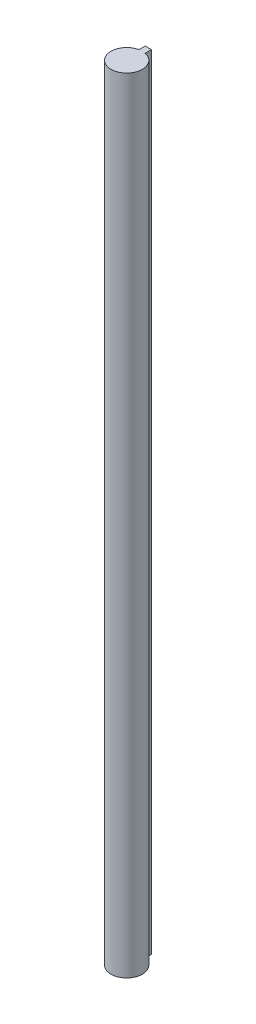
ISO-10303-21;
HEADER;
FILE_DESCRIPTION(('STEP AP214'),'2;1');
FILE_NAME('part.step','',(''),(''),'','','');
FILE_SCHEMA(('AUTOMOTIVE_DESIGN { 1 0 10303 214 1 1 1 1 }'));
ENDSEC;
DATA;
#1=APPLICATION_CONTEXT('core data for automotive mechanical design processes');
#2=APPLICATION_PROTOCOL_DEFINITION('international standard','automotive_design',2000,#1);
#3=PRODUCT_CONTEXT('',#1,'mechanical');
#4=PRODUCT('Part','Part','',(#3));
#5=PRODUCT_RELATED_PRODUCT_CATEGORY('part','',(#4));
#6=PRODUCT_DEFINITION_FORMATION('','',#4);
#7=PRODUCT_DEFINITION_CONTEXT('part definition',#1,'design');
#8=PRODUCT_DEFINITION('design','',#6,#7);
#9=PRODUCT_DEFINITION_SHAPE('','',#8);
#10=(LENGTH_UNIT() NAMED_UNIT(*) SI_UNIT(.MILLI.,.METRE.));
#11=(NAMED_UNIT(*) PLANE_ANGLE_UNIT() SI_UNIT($,.RADIAN.));
#12=(NAMED_UNIT(*) SI_UNIT($,.STERADIAN.) SOLID_ANGLE_UNIT());
#13=UNCERTAINTY_MEASURE_WITH_UNIT(LENGTH_MEASURE(1.E-05),#10,'distance_accuracy_value','');
#14=(GEOMETRIC_REPRESENTATION_CONTEXT(3) GLOBAL_UNCERTAINTY_ASSIGNED_CONTEXT((#13)) GLOBAL_UNIT_ASSIGNED_CONTEXT((#10,
#11,#12)) REPRESENTATION_CONTEXT('',''));
#15=CARTESIAN_POINT('',(0.,0.,0.));
#16=DIRECTION('',(0.,0.,1.));
#17=DIRECTION('',(1.,0.,0.));
#18=AXIS2_PLACEMENT_3D('',#15,#16,#17);
#19=CARTESIAN_POINT('',(0.,500.,0.));
#20=DIRECTION('',(0.,-1.,0.));
#21=DIRECTION('',(0.,0.,-1.));
#22=AXIS2_PLACEMENT_3D('',#19,#20,#21);
#23=CYLINDRICAL_SURFACE('',#22,10.);
#24=CARTESIAN_POINT('',(0.,0.,0.));
#25=DIRECTION('',(0.,1.,0.));
#26=DIRECTION('',(0.,0.,1.));
#27=AXIS2_PLACEMENT_3D('',#24,#25,#26);
#28=CIRCLE('',#27,10.);
#29=CARTESIAN_POINT('',(-2.,0.,-9.79795897113271));
#30=VERTEX_POINT('',#29);
#31=CARTESIAN_POINT('',(2.,0.,-9.79795897113271));
#32=VERTEX_POINT('',#31);
#33=EDGE_CURVE('E98',#30,#32,#28,.T.);
#34=ORIENTED_EDGE('',*,*,#33,.T.);
#35=DIRECTION('',(0.,-1.,0.));
#36=VECTOR('',#35,1.);
#37=CARTESIAN_POINT('',(2.,500.,-9.79795897113271));
#38=LINE('',#37,#36);
#39=CARTESIAN_POINT('',(2.,500.,-9.79795897113271));
#40=VERTEX_POINT('',#39);
#41=EDGE_CURVE('E11',#40,#32,#38,.T.);
#42=ORIENTED_EDGE('',*,*,#41,.F.);
#43=CARTESIAN_POINT('',(0.,500.,0.));
#44=DIRECTION('',(0.,1.,0.));
#45=DIRECTION('',(0.,0.,1.));
#46=AXIS2_PLACEMENT_3D('',#43,#44,#45);
#47=CIRCLE('',#46,10.);
#48=CARTESIAN_POINT('',(-2.,500.,-9.79795897113271));
#49=VERTEX_POINT('',#48);
#50=EDGE_CURVE('E86',#49,#40,#47,.T.);
#51=ORIENTED_EDGE('',*,*,#50,.F.);
#52=DIRECTION('',(0.,-1.,0.));
#53=VECTOR('',#52,1.);
#54=CARTESIAN_POINT('',(-2.,500.,-9.79795897113271));
#55=LINE('',#54,#53);
#56=EDGE_CURVE('E94',#49,#30,#55,.T.);
#57=ORIENTED_EDGE('',*,*,#56,.T.);
#58=EDGE_LOOP('',(#34,#42,#51,#57));
#59=FACE_BOUND('',#58,.T.);
#60=ADVANCED_FACE('F35',(#59),#23,.T.);
#61=CARTESIAN_POINT('',(2.,500.,-9.79795897113271));
#62=DIRECTION('',(-1.,0.,0.));
#63=DIRECTION('',(0.,0.,1.));
#64=AXIS2_PLACEMENT_3D('',#61,#62,#63);
#65=PLANE('',#64);
#66=DIRECTION('',(0.,0.,-1.));
#67=VECTOR('',#66,1.);
#68=CARTESIAN_POINT('',(2.,0.,-9.79795897113271));
#69=LINE('',#68,#67);
#70=CARTESIAN_POINT('',(2.,0.,-13.7979589711327));
#71=VERTEX_POINT('',#70);
#72=EDGE_CURVE('E90',#32,#71,#69,.T.);
#73=ORIENTED_EDGE('',*,*,#72,.T.);
#74=DIRECTION('',(0.,-1.,0.));
#75=VECTOR('',#74,1.);
#76=CARTESIAN_POINT('',(2.,500.,-13.7979589711327));
#77=LINE('',#76,#75);
#78=CARTESIAN_POINT('',(2.,500.,-13.7979589711327));
#79=VERTEX_POINT('',#78);
#80=EDGE_CURVE('E43',#79,#71,#77,.T.);
#81=ORIENTED_EDGE('',*,*,#80,.F.);
#82=DIRECTION('',(0.,0.,-1.));
#83=VECTOR('',#82,1.);
#84=CARTESIAN_POINT('',(2.,500.,-9.79795897113271));
#85=LINE('',#84,#83);
#86=EDGE_CURVE('E81',#40,#79,#85,.T.);
#87=ORIENTED_EDGE('',*,*,#86,.F.);
#88=ORIENTED_EDGE('',*,*,#41,.T.);
#89=EDGE_LOOP('',(#73,#81,#87,#88));
#90=FACE_BOUND('',#89,.T.);
#91=ADVANCED_FACE('F89',(#90),#65,.F.);
#92=CARTESIAN_POINT('',(-2.,500.,-13.7979589711327));
#93=DIRECTION('',(0.,0.,1.));
#94=DIRECTION('',(1.,0.,0.));
#95=AXIS2_PLACEMENT_3D('',#92,#93,#94);
#96=PLANE('',#95);
#97=DIRECTION('',(-1.,0.,0.));
#98=VECTOR('',#97,1.);
#99=CARTESIAN_POINT('',(-2.,0.,-13.7979589711327));
#100=LINE('',#99,#98);
#101=CARTESIAN_POINT('',(-2.,0.,-13.7979589711327));
#102=VERTEX_POINT('',#101);
#103=EDGE_CURVE('E68',#71,#102,#100,.T.);
#104=ORIENTED_EDGE('',*,*,#103,.T.);
#105=DIRECTION('',(0.,-1.,0.));
#106=VECTOR('',#105,1.);
#107=CARTESIAN_POINT('',(-2.,500.,-13.7979589711327));
#108=LINE('',#107,#106);
#109=CARTESIAN_POINT('',(-2.,500.,-13.7979589711327));
#110=VERTEX_POINT('',#109);
#111=EDGE_CURVE('E91',#110,#102,#108,.T.);
#112=ORIENTED_EDGE('',*,*,#111,.F.);
#113=DIRECTION('',(-1.,0.,0.));
#114=VECTOR('',#113,1.);
#115=CARTESIAN_POINT('',(-2.,500.,-13.7979589711327));
#116=LINE('',#115,#114);
#117=EDGE_CURVE('E84',#79,#110,#116,.T.);
#118=ORIENTED_EDGE('',*,*,#117,.F.);
#119=ORIENTED_EDGE('',*,*,#80,.T.);
#120=EDGE_LOOP('',(#104,#112,#118,#119));
#121=FACE_BOUND('',#120,.T.);
#122=ADVANCED_FACE('F92',(#121),#96,.F.);
#123=CARTESIAN_POINT('',(-2.,500.,-9.79795897113271));
#124=DIRECTION('',(1.,0.,0.));
#125=DIRECTION('',(0.,0.,-1.));
#126=AXIS2_PLACEMENT_3D('',#123,#124,#125);
#127=PLANE('',#126);
#128=DIRECTION('',(0.,0.,1.));
#129=VECTOR('',#128,1.);
#130=CARTESIAN_POINT('',(-2.,0.,-9.79795897113271));
#131=LINE('',#130,#129);
#132=EDGE_CURVE('E74',#102,#30,#131,.T.);
#133=ORIENTED_EDGE('',*,*,#132,.T.);
#134=ORIENTED_EDGE('',*,*,#56,.F.);
#135=DIRECTION('',(0.,0.,1.));
#136=VECTOR('',#135,1.);
#137=CARTESIAN_POINT('',(-2.,500.,-9.79795897113271));
#138=LINE('',#137,#136);
#139=EDGE_CURVE('E51',#110,#49,#138,.T.);
#140=ORIENTED_EDGE('',*,*,#139,.F.);
#141=ORIENTED_EDGE('',*,*,#111,.T.);
#142=EDGE_LOOP('',(#133,#134,#140,#141));
#143=FACE_BOUND('',#142,.T.);
#144=ADVANCED_FACE('F105',(#143),#127,.F.);
#145=CARTESIAN_POINT('',(0.,500.,0.));
#146=DIRECTION('',(0.,1.,0.));
#147=DIRECTION('',(0.,0.,1.));
#148=AXIS2_PLACEMENT_3D('',#145,#146,#147);
#149=PLANE('',#148);
#150=ORIENTED_EDGE('',*,*,#50,.T.);
#151=ORIENTED_EDGE('',*,*,#86,.T.);
#152=ORIENTED_EDGE('',*,*,#117,.T.);
#153=ORIENTED_EDGE('',*,*,#139,.T.);
#154=EDGE_LOOP('',(#150,#151,#152,#153));
#155=FACE_BOUND('',#154,.T.);
#156=ADVANCED_FACE('F82',(#155),#149,.T.);
#157=CARTESIAN_POINT('',(0.,0.,0.));
#158=DIRECTION('',(0.,1.,0.));
#159=DIRECTION('',(0.,0.,1.));
#160=AXIS2_PLACEMENT_3D('',#157,#158,#159);
#161=PLANE('',#160);
#162=ORIENTED_EDGE('',*,*,#33,.F.);
#163=ORIENTED_EDGE('',*,*,#132,.F.);
#164=ORIENTED_EDGE('',*,*,#103,.F.);
#165=ORIENTED_EDGE('',*,*,#72,.F.);
#166=EDGE_LOOP('',(#162,#163,#164,#165));
#167=FACE_BOUND('',#166,.T.);
#168=ADVANCED_FACE('F108',(#167),#161,.F.);
#169=CLOSED_SHELL('',(#60,#91,#122,#144,#156,#168));
#170=MANIFOLD_SOLID_BREP('B2',#169);
#171=ADVANCED_BREP_SHAPE_REPRESENTATION('',(#18,#170),#14);
#172=SHAPE_DEFINITION_REPRESENTATION(#9,#171);
ENDSEC;
END-ISO-10303-21;
